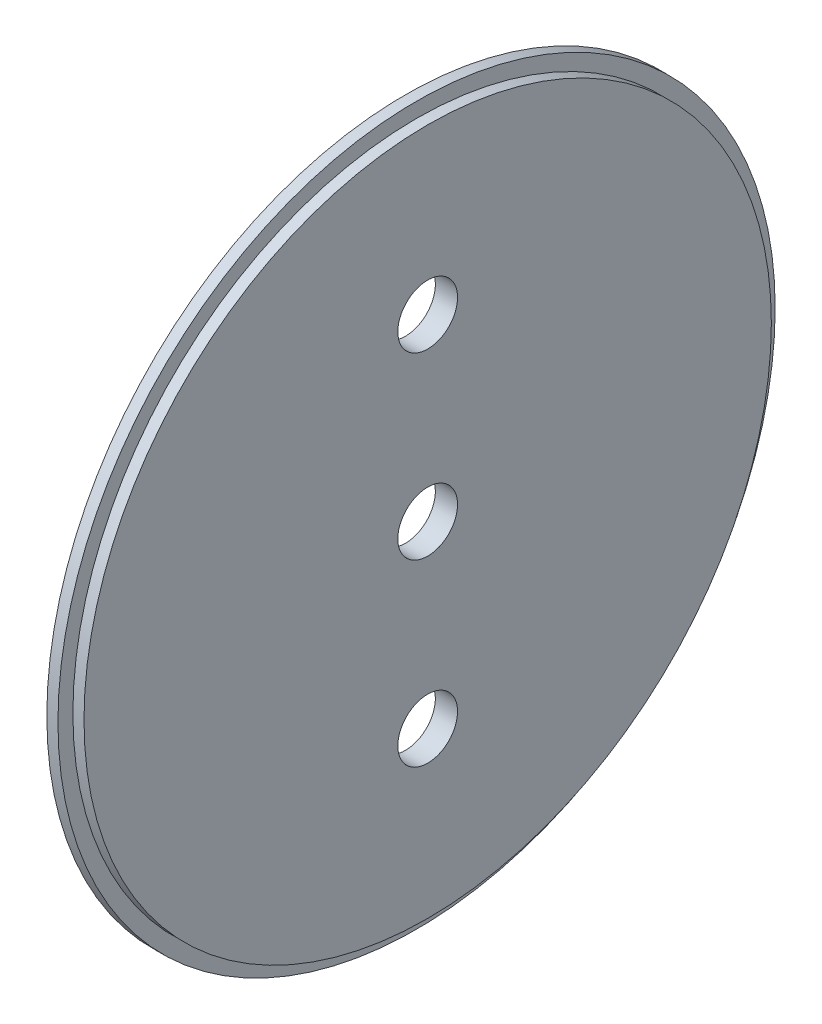
ISO-10303-21;
HEADER;
FILE_DESCRIPTION(('STEP AP214'),'2;1');
FILE_NAME('part.step','',(''),(''),'','','');
FILE_SCHEMA(('AUTOMOTIVE_DESIGN { 1 0 10303 214 1 1 1 1 }'));
ENDSEC;
DATA;
#1=APPLICATION_CONTEXT('core data for automotive mechanical design processes');
#2=APPLICATION_PROTOCOL_DEFINITION('international standard','automotive_design',2000,#1);
#3=PRODUCT_CONTEXT('',#1,'mechanical');
#4=PRODUCT('Part','Part','',(#3));
#5=PRODUCT_RELATED_PRODUCT_CATEGORY('part','',(#4));
#6=PRODUCT_DEFINITION_FORMATION('','',#4);
#7=PRODUCT_DEFINITION_CONTEXT('part definition',#1,'design');
#8=PRODUCT_DEFINITION('design','',#6,#7);
#9=PRODUCT_DEFINITION_SHAPE('','',#8);
#10=(LENGTH_UNIT() NAMED_UNIT(*) SI_UNIT(.MILLI.,.METRE.));
#11=(NAMED_UNIT(*) PLANE_ANGLE_UNIT() SI_UNIT($,.RADIAN.));
#12=(NAMED_UNIT(*) SI_UNIT($,.STERADIAN.) SOLID_ANGLE_UNIT());
#13=UNCERTAINTY_MEASURE_WITH_UNIT(LENGTH_MEASURE(1.E-05),#10,'distance_accuracy_value','');
#14=(GEOMETRIC_REPRESENTATION_CONTEXT(3) GLOBAL_UNCERTAINTY_ASSIGNED_CONTEXT((#13)) GLOBAL_UNIT_ASSIGNED_CONTEXT((#10,
#11,#12)) REPRESENTATION_CONTEXT('',''));
#15=CARTESIAN_POINT('',(0.,0.,0.));
#16=DIRECTION('',(0.,0.,1.));
#17=DIRECTION('',(1.,0.,0.));
#18=AXIS2_PLACEMENT_3D('',#15,#16,#17);
#19=CARTESIAN_POINT('',(1.1811,0.,0.));
#20=DIRECTION('',(-1.,0.,0.));
#21=DIRECTION('',(0.,0.,1.));
#22=AXIS2_PLACEMENT_3D('',#19,#20,#21);
#23=CYLINDRICAL_SURFACE('',#22,38.1);
#24=CARTESIAN_POINT('',(1.1811,0.,0.));
#25=DIRECTION('',(1.,0.,0.));
#26=DIRECTION('',(0.,0.,-1.));
#27=AXIS2_PLACEMENT_3D('',#24,#25,#26);
#28=CIRCLE('',#27,38.1);
#29=CARTESIAN_POINT('',(1.1811,0.,-38.1));
#30=VERTEX_POINT('',#29);
#31=EDGE_CURVE('E50',#30,#30,#28,.T.);
#32=ORIENTED_EDGE('',*,*,#31,.F.);
#33=EDGE_LOOP('',(#32));
#34=FACE_BOUND('',#33,.T.);
#35=CARTESIAN_POINT('',(0.,0.,0.));
#36=DIRECTION('',(1.,0.,0.));
#37=DIRECTION('',(0.,0.,-1.));
#38=AXIS2_PLACEMENT_3D('',#35,#36,#37);
#39=CIRCLE('',#38,38.1);
#40=CARTESIAN_POINT('',(0.,0.,-38.1));
#41=VERTEX_POINT('',#40);
#42=EDGE_CURVE('E45',#41,#41,#39,.T.);
#43=ORIENTED_EDGE('',*,*,#42,.T.);
#44=EDGE_LOOP('',(#43));
#45=FACE_BOUND('',#44,.T.);
#46=ADVANCED_FACE('F42',(#34,#45),#23,.T.);
#47=CARTESIAN_POINT('',(1.1811,0.,0.));
#48=DIRECTION('',(1.,0.,0.));
#49=DIRECTION('',(0.,0.,-1.));
#50=AXIS2_PLACEMENT_3D('',#47,#48,#49);
#51=PLANE('',#50);
#52=CARTESIAN_POINT('',(1.1811,0.,0.));
#53=DIRECTION('',(1.,0.,0.));
#54=DIRECTION('',(0.,0.,-1.));
#55=AXIS2_PLACEMENT_3D('',#52,#53,#54);
#56=CIRCLE('',#55,36.5125);
#57=CARTESIAN_POINT('',(1.1811,0.,-36.5125));
#58=VERTEX_POINT('',#57);
#59=EDGE_CURVE('E10',#58,#58,#56,.T.);
#60=ORIENTED_EDGE('',*,*,#59,.F.);
#61=EDGE_LOOP('',(#60));
#62=FACE_BOUND('',#61,.T.);
#63=ORIENTED_EDGE('',*,*,#31,.T.);
#64=EDGE_LOOP('',(#63));
#65=FACE_BOUND('',#64,.T.);
#66=ADVANCED_FACE('F92',(#62,#65),#51,.T.);
#67=CARTESIAN_POINT('',(0.,0.,0.));
#68=DIRECTION('',(1.,0.,0.));
#69=DIRECTION('',(0.,0.,-1.));
#70=AXIS2_PLACEMENT_3D('',#67,#68,#69);
#71=PLANE('',#70);
#72=CARTESIAN_POINT('',(0.,19.05,0.));
#73=DIRECTION('',(-1.,0.,0.));
#74=DIRECTION('',(0.,0.,1.));
#75=AXIS2_PLACEMENT_3D('',#72,#73,#74);
#76=CIRCLE('',#75,3.17500000000001);
#77=CARTESIAN_POINT('',(0.,19.05,3.17500000000001));
#78=VERTEX_POINT('',#77);
#79=EDGE_CURVE('E74',#78,#78,#76,.T.);
#80=ORIENTED_EDGE('',*,*,#79,.F.);
#81=EDGE_LOOP('',(#80));
#82=FACE_BOUND('',#81,.T.);
#83=CARTESIAN_POINT('',(0.,-19.05,0.));
#84=DIRECTION('',(-1.,0.,0.));
#85=DIRECTION('',(0.,0.,1.));
#86=AXIS2_PLACEMENT_3D('',#83,#84,#85);
#87=CIRCLE('',#86,3.175);
#88=CARTESIAN_POINT('',(0.,-19.05,3.175));
#89=VERTEX_POINT('',#88);
#90=EDGE_CURVE('E66',#89,#89,#87,.T.);
#91=ORIENTED_EDGE('',*,*,#90,.F.);
#92=EDGE_LOOP('',(#91));
#93=FACE_BOUND('',#92,.T.);
#94=CARTESIAN_POINT('',(0.,0.,0.));
#95=DIRECTION('',(-1.,0.,0.));
#96=DIRECTION('',(0.,0.,1.));
#97=AXIS2_PLACEMENT_3D('',#94,#95,#96);
#98=CIRCLE('',#97,3.175);
#99=CARTESIAN_POINT('',(0.,0.,3.175));
#100=VERTEX_POINT('',#99);
#101=EDGE_CURVE('E62',#100,#100,#98,.T.);
#102=ORIENTED_EDGE('',*,*,#101,.F.);
#103=EDGE_LOOP('',(#102));
#104=FACE_BOUND('',#103,.T.);
#105=ORIENTED_EDGE('',*,*,#42,.F.);
#106=EDGE_LOOP('',(#105));
#107=FACE_BOUND('',#106,.T.);
#108=ADVANCED_FACE('F88',(#82,#93,#104,#107),#71,.F.);
#109=CARTESIAN_POINT('',(2.3622,0.,0.));
#110=DIRECTION('',(-1.,0.,0.));
#111=DIRECTION('',(0.,0.,1.));
#112=AXIS2_PLACEMENT_3D('',#109,#110,#111);
#113=CYLINDRICAL_SURFACE('',#112,36.5125);
#114=CARTESIAN_POINT('',(2.3622,0.,0.));
#115=DIRECTION('',(1.,0.,0.));
#116=DIRECTION('',(0.,0.,-1.));
#117=AXIS2_PLACEMENT_3D('',#114,#115,#116);
#118=CIRCLE('',#117,36.5125);
#119=CARTESIAN_POINT('',(2.3622,0.,-36.5125));
#120=VERTEX_POINT('',#119);
#121=EDGE_CURVE('E57',#120,#120,#118,.T.);
#122=ORIENTED_EDGE('',*,*,#121,.F.);
#123=EDGE_LOOP('',(#122));
#124=FACE_BOUND('',#123,.T.);
#125=ORIENTED_EDGE('',*,*,#59,.T.);
#126=EDGE_LOOP('',(#125));
#127=FACE_BOUND('',#126,.T.);
#128=ADVANCED_FACE('F91',(#124,#127),#113,.T.);
#129=CARTESIAN_POINT('',(2.3622,0.,0.));
#130=DIRECTION('',(1.,0.,0.));
#131=DIRECTION('',(0.,0.,-1.));
#132=AXIS2_PLACEMENT_3D('',#129,#130,#131);
#133=PLANE('',#132);
#134=CARTESIAN_POINT('',(2.3622,19.05,0.));
#135=DIRECTION('',(-1.,0.,0.));
#136=DIRECTION('',(0.,0.,1.));
#137=AXIS2_PLACEMENT_3D('',#134,#135,#136);
#138=CIRCLE('',#137,3.17500000000001);
#139=CARTESIAN_POINT('',(2.3622,19.05,3.17500000000001));
#140=VERTEX_POINT('',#139);
#141=EDGE_CURVE('E70',#140,#140,#138,.T.);
#142=ORIENTED_EDGE('',*,*,#141,.T.);
#143=EDGE_LOOP('',(#142));
#144=FACE_BOUND('',#143,.T.);
#145=CARTESIAN_POINT('',(2.3622,-19.05,0.));
#146=DIRECTION('',(-1.,0.,0.));
#147=DIRECTION('',(0.,0.,1.));
#148=AXIS2_PLACEMENT_3D('',#145,#146,#147);
#149=CIRCLE('',#148,3.175);
#150=CARTESIAN_POINT('',(2.3622,-19.05,3.175));
#151=VERTEX_POINT('',#150);
#152=EDGE_CURVE('E78',#151,#151,#149,.T.);
#153=ORIENTED_EDGE('',*,*,#152,.T.);
#154=EDGE_LOOP('',(#153));
#155=FACE_BOUND('',#154,.T.);
#156=CARTESIAN_POINT('',(2.3622,0.,0.));
#157=DIRECTION('',(-1.,0.,0.));
#158=DIRECTION('',(0.,0.,1.));
#159=AXIS2_PLACEMENT_3D('',#156,#157,#158);
#160=CIRCLE('',#159,3.175);
#161=CARTESIAN_POINT('',(2.3622,0.,3.175));
#162=VERTEX_POINT('',#161);
#163=EDGE_CURVE('E61',#162,#162,#160,.T.);
#164=ORIENTED_EDGE('',*,*,#163,.T.);
#165=EDGE_LOOP('',(#164));
#166=FACE_BOUND('',#165,.T.);
#167=ORIENTED_EDGE('',*,*,#121,.T.);
#168=EDGE_LOOP('',(#167));
#169=FACE_BOUND('',#168,.T.);
#170=ADVANCED_FACE('F114',(#144,#155,#166,#169),#133,.T.);
#171=CARTESIAN_POINT('',(2.3622,0.,0.));
#172=DIRECTION('',(-1.,0.,0.));
#173=DIRECTION('',(0.,0.,1.));
#174=AXIS2_PLACEMENT_3D('',#171,#172,#173);
#175=CYLINDRICAL_SURFACE('',#174,3.175);
#176=ORIENTED_EDGE('',*,*,#163,.F.);
#177=EDGE_LOOP('',(#176));
#178=FACE_BOUND('',#177,.T.);
#179=ORIENTED_EDGE('',*,*,#101,.T.);
#180=EDGE_LOOP('',(#179));
#181=FACE_BOUND('',#180,.T.);
#182=ADVANCED_FACE('F118',(#178,#181),#175,.F.);
#183=CARTESIAN_POINT('',(2.3622,-19.05,0.));
#184=DIRECTION('',(-1.,0.,0.));
#185=DIRECTION('',(0.,0.,1.));
#186=AXIS2_PLACEMENT_3D('',#183,#184,#185);
#187=CYLINDRICAL_SURFACE('',#186,3.175);
#188=ORIENTED_EDGE('',*,*,#152,.F.);
#189=EDGE_LOOP('',(#188));
#190=FACE_BOUND('',#189,.T.);
#191=ORIENTED_EDGE('',*,*,#90,.T.);
#192=EDGE_LOOP('',(#191));
#193=FACE_BOUND('',#192,.T.);
#194=ADVANCED_FACE('F86',(#190,#193),#187,.F.);
#195=CARTESIAN_POINT('',(2.3622,19.05,0.));
#196=DIRECTION('',(-1.,0.,0.));
#197=DIRECTION('',(0.,0.,1.));
#198=AXIS2_PLACEMENT_3D('',#195,#196,#197);
#199=CYLINDRICAL_SURFACE('',#198,3.17500000000001);
#200=ORIENTED_EDGE('',*,*,#141,.F.);
#201=EDGE_LOOP('',(#200));
#202=FACE_BOUND('',#201,.T.);
#203=ORIENTED_EDGE('',*,*,#79,.T.);
#204=EDGE_LOOP('',(#203));
#205=FACE_BOUND('',#204,.T.);
#206=ADVANCED_FACE('F123',(#202,#205),#199,.F.);
#207=CLOSED_SHELL('',(#46,#66,#108,#128,#170,#182,#194,#206));
#208=MANIFOLD_SOLID_BREP('B2',#207);
#209=ADVANCED_BREP_SHAPE_REPRESENTATION('',(#18,#208),#14);
#210=SHAPE_DEFINITION_REPRESENTATION(#9,#209);
ENDSEC;
END-ISO-10303-21;
